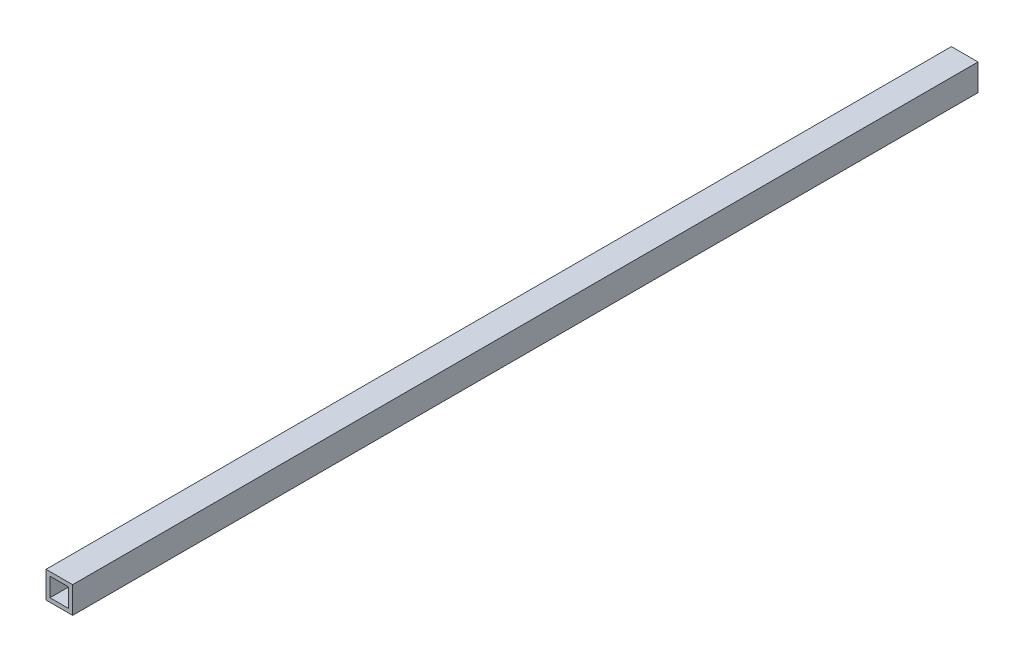
ISO-10303-21;
HEADER;
FILE_DESCRIPTION(('STEP AP214'),'2;1');
FILE_NAME('part.step','',(''),(''),'','','');
FILE_SCHEMA(('AUTOMOTIVE_DESIGN { 1 0 10303 214 1 1 1 1 }'));
ENDSEC;
DATA;
#1=APPLICATION_CONTEXT('core data for automotive mechanical design processes');
#2=APPLICATION_PROTOCOL_DEFINITION('international standard','automotive_design',2000,#1);
#3=PRODUCT_CONTEXT('',#1,'mechanical');
#4=PRODUCT('Part','Part','',(#3));
#5=PRODUCT_RELATED_PRODUCT_CATEGORY('part','',(#4));
#6=PRODUCT_DEFINITION_FORMATION('','',#4);
#7=PRODUCT_DEFINITION_CONTEXT('part definition',#1,'design');
#8=PRODUCT_DEFINITION('design','',#6,#7);
#9=PRODUCT_DEFINITION_SHAPE('','',#8);
#10=(LENGTH_UNIT() NAMED_UNIT(*) SI_UNIT(.MILLI.,.METRE.));
#11=(NAMED_UNIT(*) PLANE_ANGLE_UNIT() SI_UNIT($,.RADIAN.));
#12=(NAMED_UNIT(*) SI_UNIT($,.STERADIAN.) SOLID_ANGLE_UNIT());
#13=UNCERTAINTY_MEASURE_WITH_UNIT(LENGTH_MEASURE(1.E-05),#10,'distance_accuracy_value','');
#14=(GEOMETRIC_REPRESENTATION_CONTEXT(3) GLOBAL_UNCERTAINTY_ASSIGNED_CONTEXT((#13)) GLOBAL_UNIT_ASSIGNED_CONTEXT((#10,
#11,#12)) REPRESENTATION_CONTEXT('',''));
#15=CARTESIAN_POINT('',(0.,0.,0.));
#16=DIRECTION('',(0.,0.,1.));
#17=DIRECTION('',(1.,0.,0.));
#18=AXIS2_PLACEMENT_3D('',#15,#16,#17);
#19=CARTESIAN_POINT('',(0.,0.,340.));
#20=DIRECTION('',(0.,0.,-1.));
#21=DIRECTION('',(-1.,0.,0.));
#22=AXIS2_PLACEMENT_3D('',#19,#20,#21);
#23=PLANE('',#22);
#24=DIRECTION('',(0.,1.,0.));
#25=VECTOR('',#24,1.);
#26=CARTESIAN_POINT('',(5.,-5.,340.));
#27=LINE('',#26,#25);
#28=CARTESIAN_POINT('',(5.,-5.,340.));
#29=VERTEX_POINT('',#28);
#30=CARTESIAN_POINT('',(5.,5.,340.));
#31=VERTEX_POINT('',#30);
#32=EDGE_CURVE('E142',#29,#31,#27,.T.);
#33=ORIENTED_EDGE('',*,*,#32,.T.);
#34=DIRECTION('',(-1.,0.,0.));
#35=VECTOR('',#34,1.);
#36=CARTESIAN_POINT('',(-5.,5.,340.));
#37=LINE('',#36,#35);
#38=CARTESIAN_POINT('',(-5.,5.,340.));
#39=VERTEX_POINT('',#38);
#40=EDGE_CURVE('E145',#31,#39,#37,.T.);
#41=ORIENTED_EDGE('',*,*,#40,.T.);
#42=DIRECTION('',(0.,-1.,0.));
#43=VECTOR('',#42,1.);
#44=CARTESIAN_POINT('',(-5.,-5.,340.));
#45=LINE('',#44,#43);
#46=CARTESIAN_POINT('',(-5.,-5.,340.));
#47=VERTEX_POINT('',#46);
#48=EDGE_CURVE('E148',#39,#47,#45,.T.);
#49=ORIENTED_EDGE('',*,*,#48,.T.);
#50=DIRECTION('',(1.,0.,0.));
#51=VECTOR('',#50,1.);
#52=CARTESIAN_POINT('',(-5.,-5.,340.));
#53=LINE('',#52,#51);
#54=EDGE_CURVE('E150',#47,#29,#53,.T.);
#55=ORIENTED_EDGE('',*,*,#54,.T.);
#56=EDGE_LOOP('',(#33,#41,#49,#55));
#57=FACE_BOUND('',#56,.T.);
#58=DIRECTION('',(0.,1.,0.));
#59=VECTOR('',#58,1.);
#60=CARTESIAN_POINT('',(3.5,-3.5,340.));
#61=LINE('',#60,#59);
#62=CARTESIAN_POINT('',(3.5,-3.5,340.));
#63=VERTEX_POINT('',#62);
#64=CARTESIAN_POINT('',(3.5,3.5,340.));
#65=VERTEX_POINT('',#64);
#66=EDGE_CURVE('E106',#63,#65,#61,.T.);
#67=ORIENTED_EDGE('',*,*,#66,.F.);
#68=DIRECTION('',(1.,0.,0.));
#69=VECTOR('',#68,1.);
#70=CARTESIAN_POINT('',(-3.5,-3.5,340.));
#71=LINE('',#70,#69);
#72=CARTESIAN_POINT('',(-3.5,-3.5,340.));
#73=VERTEX_POINT('',#72);
#74=EDGE_CURVE('E128',#73,#63,#71,.T.);
#75=ORIENTED_EDGE('',*,*,#74,.F.);
#76=DIRECTION('',(0.,-1.,0.));
#77=VECTOR('',#76,1.);
#78=CARTESIAN_POINT('',(-3.5,-3.5,340.));
#79=LINE('',#78,#77);
#80=CARTESIAN_POINT('',(-3.5,3.5,340.));
#81=VERTEX_POINT('',#80);
#82=EDGE_CURVE('E126',#81,#73,#79,.T.);
#83=ORIENTED_EDGE('',*,*,#82,.F.);
#84=DIRECTION('',(-1.,0.,0.));
#85=VECTOR('',#84,1.);
#86=CARTESIAN_POINT('',(-3.5,3.5,340.));
#87=LINE('',#86,#85);
#88=EDGE_CURVE('E114',#65,#81,#87,.T.);
#89=ORIENTED_EDGE('',*,*,#88,.F.);
#90=EDGE_LOOP('',(#67,#75,#83,#89));
#91=FACE_BOUND('',#90,.T.);
#92=ADVANCED_FACE('F41',(#57,#91),#23,.F.);
#93=CARTESIAN_POINT('',(0.,0.,0.));
#94=DIRECTION('',(0.,0.,-1.));
#95=DIRECTION('',(-1.,0.,0.));
#96=AXIS2_PLACEMENT_3D('',#93,#94,#95);
#97=PLANE('',#96);
#98=DIRECTION('',(0.,1.,0.));
#99=VECTOR('',#98,1.);
#100=CARTESIAN_POINT('',(5.,-5.,0.));
#101=LINE('',#100,#99);
#102=CARTESIAN_POINT('',(5.,-5.,0.));
#103=VERTEX_POINT('',#102);
#104=CARTESIAN_POINT('',(5.,5.,0.));
#105=VERTEX_POINT('',#104);
#106=EDGE_CURVE('E122',#103,#105,#101,.T.);
#107=ORIENTED_EDGE('',*,*,#106,.F.);
#108=DIRECTION('',(1.,0.,0.));
#109=VECTOR('',#108,1.);
#110=CARTESIAN_POINT('',(-5.,-5.,0.));
#111=LINE('',#110,#109);
#112=CARTESIAN_POINT('',(-5.,-5.,0.));
#113=VERTEX_POINT('',#112);
#114=EDGE_CURVE('E146',#113,#103,#111,.T.);
#115=ORIENTED_EDGE('',*,*,#114,.F.);
#116=DIRECTION('',(0.,-1.,0.));
#117=VECTOR('',#116,1.);
#118=CARTESIAN_POINT('',(-5.,-5.,0.));
#119=LINE('',#118,#117);
#120=CARTESIAN_POINT('',(-5.,5.,0.));
#121=VERTEX_POINT('',#120);
#122=EDGE_CURVE('E157',#121,#113,#119,.T.);
#123=ORIENTED_EDGE('',*,*,#122,.F.);
#124=DIRECTION('',(-1.,0.,0.));
#125=VECTOR('',#124,1.);
#126=CARTESIAN_POINT('',(-5.,5.,0.));
#127=LINE('',#126,#125);
#128=EDGE_CURVE('E155',#105,#121,#127,.T.);
#129=ORIENTED_EDGE('',*,*,#128,.F.);
#130=EDGE_LOOP('',(#107,#115,#123,#129));
#131=FACE_BOUND('',#130,.T.);
#132=DIRECTION('',(1.,0.,0.));
#133=VECTOR('',#132,1.);
#134=CARTESIAN_POINT('',(-3.5,-3.5,0.));
#135=LINE('',#134,#133);
#136=CARTESIAN_POINT('',(-3.5,-3.5,0.));
#137=VERTEX_POINT('',#136);
#138=CARTESIAN_POINT('',(3.5,-3.5,0.));
#139=VERTEX_POINT('',#138);
#140=EDGE_CURVE('E115',#137,#139,#135,.T.);
#141=ORIENTED_EDGE('',*,*,#140,.T.);
#142=DIRECTION('',(0.,1.,0.));
#143=VECTOR('',#142,1.);
#144=CARTESIAN_POINT('',(3.5,-3.5,0.));
#145=LINE('',#144,#143);
#146=CARTESIAN_POINT('',(3.5,3.5,0.));
#147=VERTEX_POINT('',#146);
#148=EDGE_CURVE('E64',#139,#147,#145,.T.);
#149=ORIENTED_EDGE('',*,*,#148,.T.);
#150=DIRECTION('',(-1.,0.,0.));
#151=VECTOR('',#150,1.);
#152=CARTESIAN_POINT('',(-3.5,3.5,0.));
#153=LINE('',#152,#151);
#154=CARTESIAN_POINT('',(-3.5,3.5,0.));
#155=VERTEX_POINT('',#154);
#156=EDGE_CURVE('E121',#147,#155,#153,.T.);
#157=ORIENTED_EDGE('',*,*,#156,.T.);
#158=DIRECTION('',(0.,-1.,0.));
#159=VECTOR('',#158,1.);
#160=CARTESIAN_POINT('',(-3.5,-3.5,0.));
#161=LINE('',#160,#159);
#162=EDGE_CURVE('E134',#155,#137,#161,.T.);
#163=ORIENTED_EDGE('',*,*,#162,.T.);
#164=EDGE_LOOP('',(#141,#149,#157,#163));
#165=FACE_BOUND('',#164,.T.);
#166=ADVANCED_FACE('F175',(#131,#165),#97,.T.);
#167=CARTESIAN_POINT('',(5.,-5.,340.));
#168=DIRECTION('',(-1.,0.,0.));
#169=DIRECTION('',(0.,-1.,0.));
#170=AXIS2_PLACEMENT_3D('',#167,#168,#169);
#171=PLANE('',#170);
#172=ORIENTED_EDGE('',*,*,#106,.T.);
#173=DIRECTION('',(0.,0.,-1.));
#174=VECTOR('',#173,1.);
#175=CARTESIAN_POINT('',(5.,5.,340.));
#176=LINE('',#175,#174);
#177=EDGE_CURVE('E11',#31,#105,#176,.T.);
#178=ORIENTED_EDGE('',*,*,#177,.F.);
#179=ORIENTED_EDGE('',*,*,#32,.F.);
#180=DIRECTION('',(0.,0.,-1.));
#181=VECTOR('',#180,1.);
#182=CARTESIAN_POINT('',(5.,-5.,340.));
#183=LINE('',#182,#181);
#184=EDGE_CURVE('E152',#29,#103,#183,.T.);
#185=ORIENTED_EDGE('',*,*,#184,.T.);
#186=EDGE_LOOP('',(#172,#178,#179,#185));
#187=FACE_BOUND('',#186,.T.);
#188=ADVANCED_FACE('F43',(#187),#171,.F.);
#189=CARTESIAN_POINT('',(-5.,5.,340.));
#190=DIRECTION('',(0.,-1.,0.));
#191=DIRECTION('',(1.,0.,0.));
#192=AXIS2_PLACEMENT_3D('',#189,#190,#191);
#193=PLANE('',#192);
#194=ORIENTED_EDGE('',*,*,#128,.T.);
#195=DIRECTION('',(0.,0.,-1.));
#196=VECTOR('',#195,1.);
#197=CARTESIAN_POINT('',(-5.,5.,340.));
#198=LINE('',#197,#196);
#199=EDGE_CURVE('E49',#39,#121,#198,.T.);
#200=ORIENTED_EDGE('',*,*,#199,.F.);
#201=ORIENTED_EDGE('',*,*,#40,.F.);
#202=ORIENTED_EDGE('',*,*,#177,.T.);
#203=EDGE_LOOP('',(#194,#200,#201,#202));
#204=FACE_BOUND('',#203,.T.);
#205=ADVANCED_FACE('F185',(#204),#193,.F.);
#206=CARTESIAN_POINT('',(-5.,-5.,340.));
#207=DIRECTION('',(1.,0.,0.));
#208=DIRECTION('',(0.,1.,0.));
#209=AXIS2_PLACEMENT_3D('',#206,#207,#208);
#210=PLANE('',#209);
#211=ORIENTED_EDGE('',*,*,#122,.T.);
#212=DIRECTION('',(0.,0.,-1.));
#213=VECTOR('',#212,1.);
#214=CARTESIAN_POINT('',(-5.,-5.,340.));
#215=LINE('',#214,#213);
#216=EDGE_CURVE('E162',#47,#113,#215,.T.);
#217=ORIENTED_EDGE('',*,*,#216,.F.);
#218=ORIENTED_EDGE('',*,*,#48,.F.);
#219=ORIENTED_EDGE('',*,*,#199,.T.);
#220=EDGE_LOOP('',(#211,#217,#218,#219));
#221=FACE_BOUND('',#220,.T.);
#222=ADVANCED_FACE('F169',(#221),#210,.F.);
#223=CARTESIAN_POINT('',(-5.,-5.,340.));
#224=DIRECTION('',(0.,1.,0.));
#225=DIRECTION('',(0.,0.,1.));
#226=AXIS2_PLACEMENT_3D('',#223,#224,#225);
#227=PLANE('',#226);
#228=ORIENTED_EDGE('',*,*,#114,.T.);
#229=ORIENTED_EDGE('',*,*,#184,.F.);
#230=ORIENTED_EDGE('',*,*,#54,.F.);
#231=ORIENTED_EDGE('',*,*,#216,.T.);
#232=EDGE_LOOP('',(#228,#229,#230,#231));
#233=FACE_BOUND('',#232,.T.);
#234=ADVANCED_FACE('F179',(#233),#227,.F.);
#235=CARTESIAN_POINT('',(3.5,-3.5,340.));
#236=DIRECTION('',(-1.,0.,0.));
#237=DIRECTION('',(0.,-1.,0.));
#238=AXIS2_PLACEMENT_3D('',#235,#236,#237);
#239=PLANE('',#238);
#240=ORIENTED_EDGE('',*,*,#148,.F.);
#241=DIRECTION('',(0.,0.,-1.));
#242=VECTOR('',#241,1.);
#243=CARTESIAN_POINT('',(3.5,-3.5,340.));
#244=LINE('',#243,#242);
#245=EDGE_CURVE('E110',#63,#139,#244,.T.);
#246=ORIENTED_EDGE('',*,*,#245,.F.);
#247=ORIENTED_EDGE('',*,*,#66,.T.);
#248=DIRECTION('',(0.,0.,-1.));
#249=VECTOR('',#248,1.);
#250=CARTESIAN_POINT('',(3.5,3.5,340.));
#251=LINE('',#250,#249);
#252=EDGE_CURVE('E109',#65,#147,#251,.T.);
#253=ORIENTED_EDGE('',*,*,#252,.T.);
#254=EDGE_LOOP('',(#240,#246,#247,#253));
#255=FACE_BOUND('',#254,.T.);
#256=ADVANCED_FACE('F108',(#255),#239,.T.);
#257=CARTESIAN_POINT('',(-3.5,3.5,340.));
#258=DIRECTION('',(0.,-1.,0.));
#259=DIRECTION('',(1.,0.,0.));
#260=AXIS2_PLACEMENT_3D('',#257,#258,#259);
#261=PLANE('',#260);
#262=ORIENTED_EDGE('',*,*,#156,.F.);
#263=ORIENTED_EDGE('',*,*,#252,.F.);
#264=ORIENTED_EDGE('',*,*,#88,.T.);
#265=DIRECTION('',(0.,0.,-1.));
#266=VECTOR('',#265,1.);
#267=CARTESIAN_POINT('',(-3.5,3.5,340.));
#268=LINE('',#267,#266);
#269=EDGE_CURVE('E123',#81,#155,#268,.T.);
#270=ORIENTED_EDGE('',*,*,#269,.T.);
#271=EDGE_LOOP('',(#262,#263,#264,#270));
#272=FACE_BOUND('',#271,.T.);
#273=ADVANCED_FACE('F118',(#272),#261,.T.);
#274=CARTESIAN_POINT('',(-3.5,-3.5,340.));
#275=DIRECTION('',(1.,0.,0.));
#276=DIRECTION('',(0.,1.,0.));
#277=AXIS2_PLACEMENT_3D('',#274,#275,#276);
#278=PLANE('',#277);
#279=ORIENTED_EDGE('',*,*,#162,.F.);
#280=ORIENTED_EDGE('',*,*,#269,.F.);
#281=ORIENTED_EDGE('',*,*,#82,.T.);
#282=DIRECTION('',(0.,0.,-1.));
#283=VECTOR('',#282,1.);
#284=CARTESIAN_POINT('',(-3.5,-3.5,340.));
#285=LINE('',#284,#283);
#286=EDGE_CURVE('E56',#73,#137,#285,.T.);
#287=ORIENTED_EDGE('',*,*,#286,.T.);
#288=EDGE_LOOP('',(#279,#280,#281,#287));
#289=FACE_BOUND('',#288,.T.);
#290=ADVANCED_FACE('F208',(#289),#278,.T.);
#291=CARTESIAN_POINT('',(-3.5,-3.5,340.));
#292=DIRECTION('',(0.,1.,0.));
#293=DIRECTION('',(-1.,0.,0.));
#294=AXIS2_PLACEMENT_3D('',#291,#292,#293);
#295=PLANE('',#294);
#296=ORIENTED_EDGE('',*,*,#140,.F.);
#297=ORIENTED_EDGE('',*,*,#286,.F.);
#298=ORIENTED_EDGE('',*,*,#74,.T.);
#299=ORIENTED_EDGE('',*,*,#245,.T.);
#300=EDGE_LOOP('',(#296,#297,#298,#299));
#301=FACE_BOUND('',#300,.T.);
#302=ADVANCED_FACE('F212',(#301),#295,.T.);
#303=CLOSED_SHELL('',(#92,#166,#188,#205,#222,#234,#256,#273,#290,#302));
#304=MANIFOLD_SOLID_BREP('B2',#303);
#305=ADVANCED_BREP_SHAPE_REPRESENTATION('',(#18,#304),#14);
#306=SHAPE_DEFINITION_REPRESENTATION(#9,#305);
ENDSEC;
END-ISO-10303-21;
